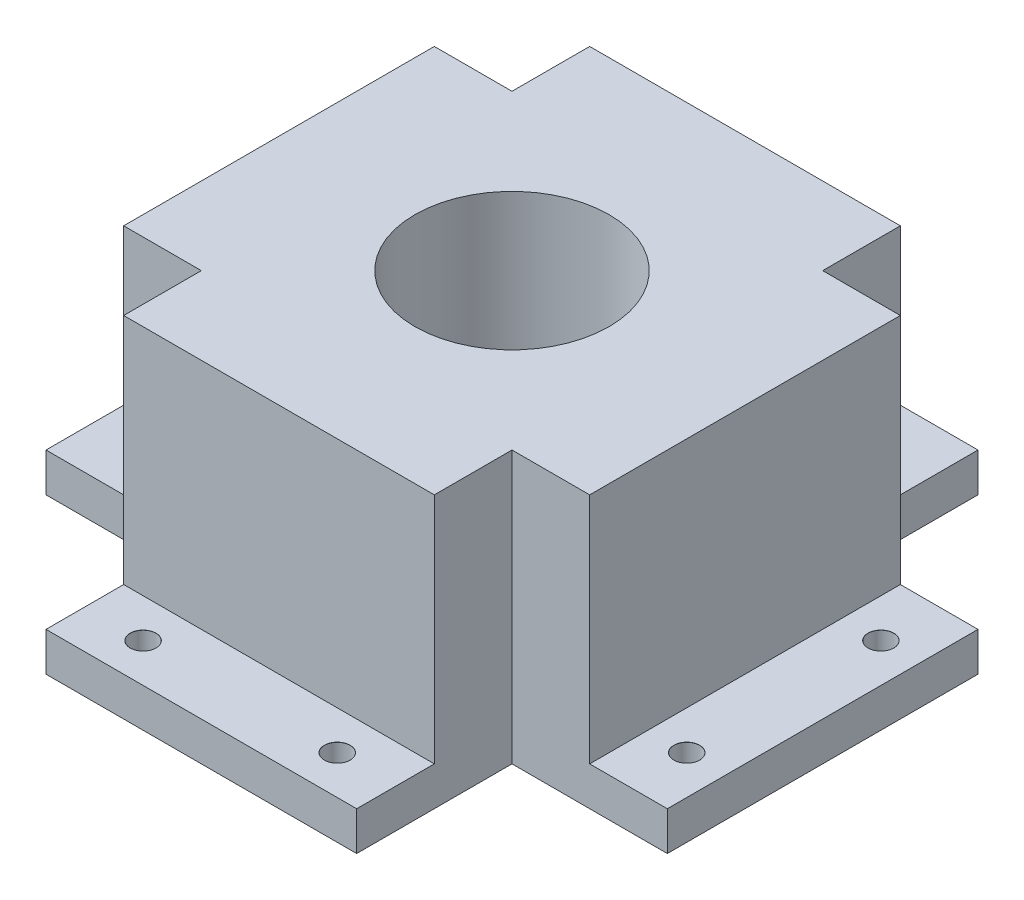
ISO-10303-21;
HEADER;
FILE_DESCRIPTION(('STEP AP214'),'2;1');
FILE_NAME('part.step','',(''),(''),'','','');
FILE_SCHEMA(('AUTOMOTIVE_DESIGN { 1 0 10303 214 1 1 1 1 }'));
ENDSEC;
DATA;
#1=APPLICATION_CONTEXT('core data for automotive mechanical design processes');
#2=APPLICATION_PROTOCOL_DEFINITION('international standard','automotive_design',2000,#1);
#3=PRODUCT_CONTEXT('',#1,'mechanical');
#4=PRODUCT('Part','Part','',(#3));
#5=PRODUCT_RELATED_PRODUCT_CATEGORY('part','',(#4));
#6=PRODUCT_DEFINITION_FORMATION('','',#4);
#7=PRODUCT_DEFINITION_CONTEXT('part definition',#1,'design');
#8=PRODUCT_DEFINITION('design','',#6,#7);
#9=PRODUCT_DEFINITION_SHAPE('','',#8);
#10=(LENGTH_UNIT() NAMED_UNIT(*) SI_UNIT(.MILLI.,.METRE.));
#11=(NAMED_UNIT(*) PLANE_ANGLE_UNIT() SI_UNIT($,.RADIAN.));
#12=(NAMED_UNIT(*) SI_UNIT($,.STERADIAN.) SOLID_ANGLE_UNIT());
#13=UNCERTAINTY_MEASURE_WITH_UNIT(LENGTH_MEASURE(1.E-05),#10,'distance_accuracy_value','');
#14=(GEOMETRIC_REPRESENTATION_CONTEXT(3) GLOBAL_UNCERTAINTY_ASSIGNED_CONTEXT((#13)) GLOBAL_UNIT_ASSIGNED_CONTEXT((#10,
#11,#12)) REPRESENTATION_CONTEXT('',''));
#15=CARTESIAN_POINT('',(0.,0.,0.));
#16=DIRECTION('',(0.,0.,1.));
#17=DIRECTION('',(1.,0.,0.));
#18=AXIS2_PLACEMENT_3D('',#15,#16,#17);
#19=CARTESIAN_POINT('',(80.,70.,-80.));
#20=DIRECTION('',(-1.,0.,0.));
#21=DIRECTION('',(0.,0.,1.));
#22=AXIS2_PLACEMENT_3D('',#19,#20,#21);
#23=PLANE('',#22);
#24=DIRECTION('',(0.,0.,1.));
#25=VECTOR('',#24,1.);
#26=CARTESIAN_POINT('',(80.,9.99999999999999,0.));
#27=LINE('',#26,#25);
#28=CARTESIAN_POINT('',(80.,10.,-40.));
#29=VERTEX_POINT('',#28);
#30=CARTESIAN_POINT('',(80.,9.99999999999999,40.));
#31=VERTEX_POINT('',#30);
#32=EDGE_CURVE('E321',#29,#31,#27,.T.);
#33=ORIENTED_EDGE('',*,*,#32,.T.);
#34=DIRECTION('',(0.,1.,0.));
#35=VECTOR('',#34,1.);
#36=CARTESIAN_POINT('',(80.,0.,40.));
#37=LINE('',#36,#35);
#38=CARTESIAN_POINT('',(80.,0.,40.));
#39=VERTEX_POINT('',#38);
#40=EDGE_CURVE('E349',#39,#31,#37,.T.);
#41=ORIENTED_EDGE('',*,*,#40,.F.);
#42=DIRECTION('',(0.,0.,-1.));
#43=VECTOR('',#42,1.);
#44=CARTESIAN_POINT('',(80.,0.,-80.));
#45=LINE('',#44,#43);
#46=CARTESIAN_POINT('',(80.,0.,-40.));
#47=VERTEX_POINT('',#46);
#48=EDGE_CURVE('E220',#39,#47,#45,.T.);
#49=ORIENTED_EDGE('',*,*,#48,.T.);
#50=DIRECTION('',(0.,1.,0.));
#51=VECTOR('',#50,1.);
#52=CARTESIAN_POINT('',(80.,0.,-40.));
#53=LINE('',#52,#51);
#54=EDGE_CURVE('E275',#47,#29,#53,.T.);
#55=ORIENTED_EDGE('',*,*,#54,.T.);
#56=EDGE_LOOP('',(#33,#41,#49,#55));
#57=FACE_BOUND('',#56,.T.);
#58=ADVANCED_FACE('F45',(#57),#23,.F.);
#59=CARTESIAN_POINT('',(-80.,70.,-80.));
#60=DIRECTION('',(0.,0.,1.));
#61=DIRECTION('',(1.,0.,0.));
#62=AXIS2_PLACEMENT_3D('',#59,#60,#61);
#63=PLANE('',#62);
#64=DIRECTION('',(1.,0.,0.));
#65=VECTOR('',#64,1.);
#66=CARTESIAN_POINT('',(0.,9.99999999999999,-80.));
#67=LINE('',#66,#65);
#68=CARTESIAN_POINT('',(-40.,9.99999999999999,-80.));
#69=VERTEX_POINT('',#68);
#70=CARTESIAN_POINT('',(40.,9.99999999999999,-80.));
#71=VERTEX_POINT('',#70);
#72=EDGE_CURVE('E265',#69,#71,#67,.T.);
#73=ORIENTED_EDGE('',*,*,#72,.T.);
#74=DIRECTION('',(0.,1.,0.));
#75=VECTOR('',#74,1.);
#76=CARTESIAN_POINT('',(40.,0.,-80.));
#77=LINE('',#76,#75);
#78=CARTESIAN_POINT('',(40.,0.,-80.));
#79=VERTEX_POINT('',#78);
#80=EDGE_CURVE('E264',#79,#71,#77,.T.);
#81=ORIENTED_EDGE('',*,*,#80,.F.);
#82=DIRECTION('',(-1.,0.,0.));
#83=VECTOR('',#82,1.);
#84=CARTESIAN_POINT('',(-80.,0.,-80.));
#85=LINE('',#84,#83);
#86=CARTESIAN_POINT('',(-40.,0.,-80.));
#87=VERTEX_POINT('',#86);
#88=EDGE_CURVE('E227',#79,#87,#85,.T.);
#89=ORIENTED_EDGE('',*,*,#88,.T.);
#90=DIRECTION('',(0.,1.,0.));
#91=VECTOR('',#90,1.);
#92=CARTESIAN_POINT('',(-40.,0.,-80.));
#93=LINE('',#92,#91);
#94=EDGE_CURVE('E217',#87,#69,#93,.T.);
#95=ORIENTED_EDGE('',*,*,#94,.T.);
#96=EDGE_LOOP('',(#73,#81,#89,#95));
#97=FACE_BOUND('',#96,.T.);
#98=ADVANCED_FACE('F262',(#97),#63,.F.);
#99=CARTESIAN_POINT('',(-80.,70.,-80.));
#100=DIRECTION('',(1.,0.,0.));
#101=DIRECTION('',(0.,0.,-1.));
#102=AXIS2_PLACEMENT_3D('',#99,#100,#101);
#103=PLANE('',#102);
#104=DIRECTION('',(0.,0.,-1.));
#105=VECTOR('',#104,1.);
#106=CARTESIAN_POINT('',(-80.,9.99999999999999,0.));
#107=LINE('',#106,#105);
#108=CARTESIAN_POINT('',(-80.,10.,40.));
#109=VERTEX_POINT('',#108);
#110=CARTESIAN_POINT('',(-80.,9.99999999999999,-40.));
#111=VERTEX_POINT('',#110);
#112=EDGE_CURVE('E59',#109,#111,#107,.T.);
#113=ORIENTED_EDGE('',*,*,#112,.T.);
#114=DIRECTION('',(0.,1.,0.));
#115=VECTOR('',#114,1.);
#116=CARTESIAN_POINT('',(-80.,0.,-40.));
#117=LINE('',#116,#115);
#118=CARTESIAN_POINT('',(-80.,0.,-40.));
#119=VERTEX_POINT('',#118);
#120=EDGE_CURVE('E222',#119,#111,#117,.T.);
#121=ORIENTED_EDGE('',*,*,#120,.F.);
#122=DIRECTION('',(0.,0.,1.));
#123=VECTOR('',#122,1.);
#124=CARTESIAN_POINT('',(-80.,0.,-80.));
#125=LINE('',#124,#123);
#126=CARTESIAN_POINT('',(-80.,0.,40.));
#127=VERTEX_POINT('',#126);
#128=EDGE_CURVE('E52',#119,#127,#125,.T.);
#129=ORIENTED_EDGE('',*,*,#128,.T.);
#130=DIRECTION('',(0.,1.,0.));
#131=VECTOR('',#130,1.);
#132=CARTESIAN_POINT('',(-80.,0.,40.));
#133=LINE('',#132,#131);
#134=EDGE_CURVE('E235',#127,#109,#133,.T.);
#135=ORIENTED_EDGE('',*,*,#134,.T.);
#136=EDGE_LOOP('',(#113,#121,#129,#135));
#137=FACE_BOUND('',#136,.T.);
#138=ADVANCED_FACE('F234',(#137),#103,.F.);
#139=CARTESIAN_POINT('',(-80.,70.,80.));
#140=DIRECTION('',(0.,0.,-1.));
#141=DIRECTION('',(-1.,0.,0.));
#142=AXIS2_PLACEMENT_3D('',#139,#140,#141);
#143=PLANE('',#142);
#144=DIRECTION('',(-1.,0.,0.));
#145=VECTOR('',#144,1.);
#146=CARTESIAN_POINT('',(0.,9.99999999999999,80.));
#147=LINE('',#146,#145);
#148=CARTESIAN_POINT('',(40.,9.99999999999999,80.));
#149=VERTEX_POINT('',#148);
#150=CARTESIAN_POINT('',(-40.,9.99999999999999,80.));
#151=VERTEX_POINT('',#150);
#152=EDGE_CURVE('E334',#149,#151,#147,.T.);
#153=ORIENTED_EDGE('',*,*,#152,.T.);
#154=DIRECTION('',(0.,1.,0.));
#155=VECTOR('',#154,1.);
#156=CARTESIAN_POINT('',(-40.,0.,80.));
#157=LINE('',#156,#155);
#158=CARTESIAN_POINT('',(-40.,0.,80.));
#159=VERTEX_POINT('',#158);
#160=EDGE_CURVE('E248',#159,#151,#157,.T.);
#161=ORIENTED_EDGE('',*,*,#160,.F.);
#162=DIRECTION('',(1.,0.,0.));
#163=VECTOR('',#162,1.);
#164=CARTESIAN_POINT('',(-80.,0.,80.));
#165=LINE('',#164,#163);
#166=CARTESIAN_POINT('',(40.,0.,80.));
#167=VERTEX_POINT('',#166);
#168=EDGE_CURVE('E12',#159,#167,#165,.T.);
#169=ORIENTED_EDGE('',*,*,#168,.T.);
#170=DIRECTION('',(0.,1.,0.));
#171=VECTOR('',#170,1.);
#172=CARTESIAN_POINT('',(40.,0.,80.));
#173=LINE('',#172,#171);
#174=EDGE_CURVE('E356',#167,#149,#173,.T.);
#175=ORIENTED_EDGE('',*,*,#174,.T.);
#176=EDGE_LOOP('',(#153,#161,#169,#175));
#177=FACE_BOUND('',#176,.T.);
#178=ADVANCED_FACE('F387',(#177),#143,.F.);
#179=CARTESIAN_POINT('',(0.,70.,0.));
#180=DIRECTION('',(0.,1.,0.));
#181=DIRECTION('',(0.,0.,1.));
#182=AXIS2_PLACEMENT_3D('',#179,#180,#181);
#183=PLANE('',#182);
#184=CARTESIAN_POINT('',(0.,70.,0.));
#185=DIRECTION('',(0.,1.,0.));
#186=DIRECTION('',(0.,0.,1.));
#187=AXIS2_PLACEMENT_3D('',#184,#185,#186);
#188=CIRCLE('',#187,25.);
#189=CARTESIAN_POINT('',(0.,70.,25.));
#190=VERTEX_POINT('',#189);
#191=EDGE_CURVE('E838',#190,#190,#188,.T.);
#192=ORIENTED_EDGE('',*,*,#191,.F.);
#193=EDGE_LOOP('',(#192));
#194=FACE_BOUND('',#193,.T.);
#195=DIRECTION('',(1.,0.,0.));
#196=VECTOR('',#195,1.);
#197=CARTESIAN_POINT('',(0.,70.,-60.));
#198=LINE('',#197,#196);
#199=CARTESIAN_POINT('',(-40.,70.,-60.));
#200=VERTEX_POINT('',#199);
#201=CARTESIAN_POINT('',(40.,70.,-60.));
#202=VERTEX_POINT('',#201);
#203=EDGE_CURVE('E185',#200,#202,#198,.T.);
#204=ORIENTED_EDGE('',*,*,#203,.F.);
#205=DIRECTION('',(0.,0.,-1.));
#206=VECTOR('',#205,1.);
#207=CARTESIAN_POINT('',(-40.,70.,-80.));
#208=LINE('',#207,#206);
#209=CARTESIAN_POINT('',(-40.,70.,-40.));
#210=VERTEX_POINT('',#209);
#211=EDGE_CURVE('E199',#210,#200,#208,.T.);
#212=ORIENTED_EDGE('',*,*,#211,.F.);
#213=DIRECTION('',(1.,0.,0.));
#214=VECTOR('',#213,1.);
#215=CARTESIAN_POINT('',(-80.,70.,-40.));
#216=LINE('',#215,#214);
#217=CARTESIAN_POINT('',(-60.,70.,-40.));
#218=VERTEX_POINT('',#217);
#219=EDGE_CURVE('E209',#218,#210,#216,.T.);
#220=ORIENTED_EDGE('',*,*,#219,.F.);
#221=DIRECTION('',(0.,0.,1.));
#222=VECTOR('',#221,1.);
#223=CARTESIAN_POINT('',(-60.,70.,0.));
#224=LINE('',#223,#222);
#225=CARTESIAN_POINT('',(-60.,70.,40.));
#226=VERTEX_POINT('',#225);
#227=EDGE_CURVE('E300',#218,#226,#224,.T.);
#228=ORIENTED_EDGE('',*,*,#227,.T.);
#229=DIRECTION('',(-1.,0.,0.));
#230=VECTOR('',#229,1.);
#231=CARTESIAN_POINT('',(-80.,70.,40.));
#232=LINE('',#231,#230);
#233=CARTESIAN_POINT('',(-40.,70.,40.));
#234=VERTEX_POINT('',#233);
#235=EDGE_CURVE('E250',#234,#226,#232,.T.);
#236=ORIENTED_EDGE('',*,*,#235,.F.);
#237=DIRECTION('',(0.,0.,-1.));
#238=VECTOR('',#237,1.);
#239=CARTESIAN_POINT('',(-40.,70.,80.));
#240=LINE('',#239,#238);
#241=CARTESIAN_POINT('',(-40.,70.,60.));
#242=VERTEX_POINT('',#241);
#243=EDGE_CURVE('E256',#242,#234,#240,.T.);
#244=ORIENTED_EDGE('',*,*,#243,.F.);
#245=DIRECTION('',(1.,0.,0.));
#246=VECTOR('',#245,1.);
#247=CARTESIAN_POINT('',(0.,70.,60.));
#248=LINE('',#247,#246);
#249=CARTESIAN_POINT('',(40.,70.,60.));
#250=VERTEX_POINT('',#249);
#251=EDGE_CURVE('E343',#242,#250,#248,.T.);
#252=ORIENTED_EDGE('',*,*,#251,.T.);
#253=DIRECTION('',(0.,0.,1.));
#254=VECTOR('',#253,1.);
#255=CARTESIAN_POINT('',(40.,70.,80.));
#256=LINE('',#255,#254);
#257=CARTESIAN_POINT('',(40.,70.,40.));
#258=VERTEX_POINT('',#257);
#259=EDGE_CURVE('E359',#258,#250,#256,.T.);
#260=ORIENTED_EDGE('',*,*,#259,.F.);
#261=DIRECTION('',(-1.,0.,0.));
#262=VECTOR('',#261,1.);
#263=CARTESIAN_POINT('',(80.,70.,40.));
#264=LINE('',#263,#262);
#265=CARTESIAN_POINT('',(60.,70.,40.));
#266=VERTEX_POINT('',#265);
#267=EDGE_CURVE('E289',#266,#258,#264,.T.);
#268=ORIENTED_EDGE('',*,*,#267,.F.);
#269=DIRECTION('',(0.,0.,1.));
#270=VECTOR('',#269,1.);
#271=CARTESIAN_POINT('',(60.,70.,0.));
#272=LINE('',#271,#270);
#273=CARTESIAN_POINT('',(60.,70.,-40.));
#274=VERTEX_POINT('',#273);
#275=EDGE_CURVE('E327',#274,#266,#272,.T.);
#276=ORIENTED_EDGE('',*,*,#275,.F.);
#277=DIRECTION('',(1.,0.,0.));
#278=VECTOR('',#277,1.);
#279=CARTESIAN_POINT('',(80.,70.,-40.));
#280=LINE('',#279,#278);
#281=CARTESIAN_POINT('',(40.,70.,-40.));
#282=VERTEX_POINT('',#281);
#283=EDGE_CURVE('E283',#282,#274,#280,.T.);
#284=ORIENTED_EDGE('',*,*,#283,.F.);
#285=DIRECTION('',(0.,0.,1.));
#286=VECTOR('',#285,1.);
#287=CARTESIAN_POINT('',(40.,70.,-80.));
#288=LINE('',#287,#286);
#289=EDGE_CURVE('E201',#202,#282,#288,.T.);
#290=ORIENTED_EDGE('',*,*,#289,.F.);
#291=EDGE_LOOP('',(#204,#212,#220,#228,#236,#244,#252,#260,#268,#276,#284,#290));
#292=FACE_BOUND('',#291,.T.);
#293=ADVANCED_FACE('F197',(#194,#292),#183,.T.);
#294=CARTESIAN_POINT('',(-80.,0.,-40.));
#295=DIRECTION('',(0.,0.,1.));
#296=DIRECTION('',(1.,0.,0.));
#297=AXIS2_PLACEMENT_3D('',#294,#295,#296);
#298=PLANE('',#297);
#299=DIRECTION('',(0.,1.,0.));
#300=VECTOR('',#299,1.);
#301=CARTESIAN_POINT('',(-60.,-82.4621125123532,-40.));
#302=LINE('',#301,#300);
#303=CARTESIAN_POINT('',(-60.,9.99999999999999,-40.));
#304=VERTEX_POINT('',#303);
#305=EDGE_CURVE('E304',#304,#218,#302,.T.);
#306=ORIENTED_EDGE('',*,*,#305,.T.);
#307=ORIENTED_EDGE('',*,*,#219,.T.);
#308=DIRECTION('',(0.,1.,0.));
#309=VECTOR('',#308,1.);
#310=CARTESIAN_POINT('',(-40.,0.,-40.));
#311=LINE('',#310,#309);
#312=CARTESIAN_POINT('',(-40.,0.,-40.));
#313=VERTEX_POINT('',#312);
#314=EDGE_CURVE('E207',#313,#210,#311,.T.);
#315=ORIENTED_EDGE('',*,*,#314,.F.);
#316=DIRECTION('',(1.,0.,0.));
#317=VECTOR('',#316,1.);
#318=CARTESIAN_POINT('',(-80.,0.,-40.));
#319=LINE('',#318,#317);
#320=EDGE_CURVE('E208',#119,#313,#319,.T.);
#321=ORIENTED_EDGE('',*,*,#320,.F.);
#322=ORIENTED_EDGE('',*,*,#120,.T.);
#323=DIRECTION('',(1.,0.,0.));
#324=VECTOR('',#323,1.);
#325=CARTESIAN_POINT('',(0.,9.99999999999999,-40.));
#326=LINE('',#325,#324);
#327=EDGE_CURVE('E202',#111,#304,#326,.T.);
#328=ORIENTED_EDGE('',*,*,#327,.T.);
#329=EDGE_LOOP('',(#306,#307,#315,#321,#322,#328));
#330=FACE_BOUND('',#329,.T.);
#331=ADVANCED_FACE('F420',(#330),#298,.F.);
#332=CARTESIAN_POINT('',(40.,0.,80.));
#333=DIRECTION('',(-1.,0.,0.));
#334=DIRECTION('',(0.,0.,1.));
#335=AXIS2_PLACEMENT_3D('',#332,#333,#334);
#336=PLANE('',#335);
#337=DIRECTION('',(0.,1.,0.));
#338=VECTOR('',#337,1.);
#339=CARTESIAN_POINT('',(40.,-82.4621125123532,60.));
#340=LINE('',#339,#338);
#341=CARTESIAN_POINT('',(40.,9.99999999999999,60.));
#342=VERTEX_POINT('',#341);
#343=EDGE_CURVE('E338',#342,#250,#340,.T.);
#344=ORIENTED_EDGE('',*,*,#343,.F.);
#345=DIRECTION('',(0.,0.,1.));
#346=VECTOR('',#345,1.);
#347=CARTESIAN_POINT('',(40.,9.99999999999999,0.));
#348=LINE('',#347,#346);
#349=EDGE_CURVE('E337',#342,#149,#348,.T.);
#350=ORIENTED_EDGE('',*,*,#349,.T.);
#351=ORIENTED_EDGE('',*,*,#174,.F.);
#352=DIRECTION('',(0.,0.,1.));
#353=VECTOR('',#352,1.);
#354=CARTESIAN_POINT('',(40.,0.,80.));
#355=LINE('',#354,#353);
#356=CARTESIAN_POINT('',(40.,0.,40.));
#357=VERTEX_POINT('',#356);
#358=EDGE_CURVE('E352',#357,#167,#355,.T.);
#359=ORIENTED_EDGE('',*,*,#358,.F.);
#360=DIRECTION('',(0.,1.,0.));
#361=VECTOR('',#360,1.);
#362=CARTESIAN_POINT('',(40.,0.,40.));
#363=LINE('',#362,#361);
#364=EDGE_CURVE('E353',#357,#258,#363,.T.);
#365=ORIENTED_EDGE('',*,*,#364,.T.);
#366=ORIENTED_EDGE('',*,*,#259,.T.);
#367=EDGE_LOOP('',(#344,#350,#351,#359,#365,#366));
#368=FACE_BOUND('',#367,.T.);
#369=ADVANCED_FACE('F384',(#368),#336,.F.);
#370=CARTESIAN_POINT('',(-80.,0.,40.));
#371=DIRECTION('',(0.,0.,-1.));
#372=DIRECTION('',(-1.,0.,0.));
#373=AXIS2_PLACEMENT_3D('',#370,#371,#372);
#374=PLANE('',#373);
#375=DIRECTION('',(0.,1.,0.));
#376=VECTOR('',#375,1.);
#377=CARTESIAN_POINT('',(-60.,-82.4621125123532,40.));
#378=LINE('',#377,#376);
#379=CARTESIAN_POINT('',(-60.,9.99999999999999,40.));
#380=VERTEX_POINT('',#379);
#381=EDGE_CURVE('E307',#380,#226,#378,.T.);
#382=ORIENTED_EDGE('',*,*,#381,.F.);
#383=DIRECTION('',(-1.,0.,0.));
#384=VECTOR('',#383,1.);
#385=CARTESIAN_POINT('',(0.,9.99999999999999,40.));
#386=LINE('',#385,#384);
#387=EDGE_CURVE('E826',#380,#109,#386,.T.);
#388=ORIENTED_EDGE('',*,*,#387,.T.);
#389=ORIENTED_EDGE('',*,*,#134,.F.);
#390=DIRECTION('',(-1.,0.,0.));
#391=VECTOR('',#390,1.);
#392=CARTESIAN_POINT('',(-80.,0.,40.));
#393=LINE('',#392,#391);
#394=CARTESIAN_POINT('',(-40.,0.,40.));
#395=VERTEX_POINT('',#394);
#396=EDGE_CURVE('E242',#395,#127,#393,.T.);
#397=ORIENTED_EDGE('',*,*,#396,.F.);
#398=DIRECTION('',(0.,1.,0.));
#399=VECTOR('',#398,1.);
#400=CARTESIAN_POINT('',(-40.,0.,40.));
#401=LINE('',#400,#399);
#402=EDGE_CURVE('E253',#395,#234,#401,.T.);
#403=ORIENTED_EDGE('',*,*,#402,.T.);
#404=ORIENTED_EDGE('',*,*,#235,.T.);
#405=EDGE_LOOP('',(#382,#388,#389,#397,#403,#404));
#406=FACE_BOUND('',#405,.T.);
#407=ADVANCED_FACE('F298',(#406),#374,.F.);
#408=CARTESIAN_POINT('',(-40.,0.,80.));
#409=DIRECTION('',(1.,0.,0.));
#410=DIRECTION('',(0.,0.,-1.));
#411=AXIS2_PLACEMENT_3D('',#408,#409,#410);
#412=PLANE('',#411);
#413=DIRECTION('',(0.,1.,0.));
#414=VECTOR('',#413,1.);
#415=CARTESIAN_POINT('',(-40.,-82.4621125123532,60.));
#416=LINE('',#415,#414);
#417=CARTESIAN_POINT('',(-40.,10.,60.));
#418=VERTEX_POINT('',#417);
#419=EDGE_CURVE('E67',#418,#242,#416,.T.);
#420=ORIENTED_EDGE('',*,*,#419,.T.);
#421=ORIENTED_EDGE('',*,*,#243,.T.);
#422=ORIENTED_EDGE('',*,*,#402,.F.);
#423=DIRECTION('',(0.,0.,-1.));
#424=VECTOR('',#423,1.);
#425=CARTESIAN_POINT('',(-40.,0.,80.));
#426=LINE('',#425,#424);
#427=EDGE_CURVE('E244',#159,#395,#426,.T.);
#428=ORIENTED_EDGE('',*,*,#427,.F.);
#429=ORIENTED_EDGE('',*,*,#160,.T.);
#430=DIRECTION('',(0.,0.,-1.));
#431=VECTOR('',#430,1.);
#432=CARTESIAN_POINT('',(-40.,9.99999999999999,0.));
#433=LINE('',#432,#431);
#434=EDGE_CURVE('E330',#151,#418,#433,.T.);
#435=ORIENTED_EDGE('',*,*,#434,.T.);
#436=EDGE_LOOP('',(#420,#421,#422,#428,#429,#435));
#437=FACE_BOUND('',#436,.T.);
#438=ADVANCED_FACE('F295',(#437),#412,.F.);
#439=CARTESIAN_POINT('',(0.,0.,0.));
#440=DIRECTION('',(0.,1.,0.));
#441=DIRECTION('',(0.,0.,1.));
#442=AXIS2_PLACEMENT_3D('',#439,#440,#441);
#443=PLANE('',#442);
#444=CARTESIAN_POINT('',(-70.,0.,-25.));
#445=DIRECTION('',(0.,1.,0.));
#446=DIRECTION('',(0.,0.,1.));
#447=AXIS2_PLACEMENT_3D('',#444,#445,#446);
#448=CIRCLE('',#447,3.3);
#449=CARTESIAN_POINT('',(-70.,0.,-21.7));
#450=VERTEX_POINT('',#449);
#451=EDGE_CURVE('E904',#450,#450,#448,.T.);
#452=ORIENTED_EDGE('',*,*,#451,.T.);
#453=EDGE_LOOP('',(#452));
#454=FACE_BOUND('',#453,.T.);
#455=CARTESIAN_POINT('',(-70.,0.,25.));
#456=DIRECTION('',(0.,1.,0.));
#457=DIRECTION('',(0.,0.,1.));
#458=AXIS2_PLACEMENT_3D('',#455,#456,#457);
#459=CIRCLE('',#458,3.3);
#460=CARTESIAN_POINT('',(-70.,0.,28.3));
#461=VERTEX_POINT('',#460);
#462=EDGE_CURVE('E895',#461,#461,#459,.T.);
#463=ORIENTED_EDGE('',*,*,#462,.T.);
#464=EDGE_LOOP('',(#463));
#465=FACE_BOUND('',#464,.T.);
#466=CARTESIAN_POINT('',(-25.,0.,-70.));
#467=DIRECTION('',(0.,1.,0.));
#468=DIRECTION('',(0.,0.,1.));
#469=AXIS2_PLACEMENT_3D('',#466,#467,#468);
#470=CIRCLE('',#469,3.29999999999999);
#471=CARTESIAN_POINT('',(-25.,0.,-66.7));
#472=VERTEX_POINT('',#471);
#473=EDGE_CURVE('E886',#472,#472,#470,.T.);
#474=ORIENTED_EDGE('',*,*,#473,.T.);
#475=EDGE_LOOP('',(#474));
#476=FACE_BOUND('',#475,.T.);
#477=CARTESIAN_POINT('',(25.,0.,-70.));
#478=DIRECTION('',(0.,1.,0.));
#479=DIRECTION('',(0.,0.,1.));
#480=AXIS2_PLACEMENT_3D('',#477,#478,#479);
#481=CIRCLE('',#480,3.29999999999999);
#482=CARTESIAN_POINT('',(25.,0.,-66.7));
#483=VERTEX_POINT('',#482);
#484=EDGE_CURVE('E877',#483,#483,#481,.T.);
#485=ORIENTED_EDGE('',*,*,#484,.T.);
#486=EDGE_LOOP('',(#485));
#487=FACE_BOUND('',#486,.T.);
#488=CARTESIAN_POINT('',(70.,0.,-25.));
#489=DIRECTION('',(0.,1.,0.));
#490=DIRECTION('',(0.,0.,1.));
#491=AXIS2_PLACEMENT_3D('',#488,#489,#490);
#492=CIRCLE('',#491,3.3);
#493=CARTESIAN_POINT('',(70.,0.,-21.7));
#494=VERTEX_POINT('',#493);
#495=EDGE_CURVE('E868',#494,#494,#492,.T.);
#496=ORIENTED_EDGE('',*,*,#495,.T.);
#497=EDGE_LOOP('',(#496));
#498=FACE_BOUND('',#497,.T.);
#499=CARTESIAN_POINT('',(70.,0.,25.));
#500=DIRECTION('',(0.,1.,0.));
#501=DIRECTION('',(0.,0.,1.));
#502=AXIS2_PLACEMENT_3D('',#499,#500,#501);
#503=CIRCLE('',#502,3.3);
#504=CARTESIAN_POINT('',(70.,0.,28.3));
#505=VERTEX_POINT('',#504);
#506=EDGE_CURVE('E859',#505,#505,#503,.T.);
#507=ORIENTED_EDGE('',*,*,#506,.T.);
#508=EDGE_LOOP('',(#507));
#509=FACE_BOUND('',#508,.T.);
#510=CARTESIAN_POINT('',(25.,0.,70.));
#511=DIRECTION('',(0.,1.,0.));
#512=DIRECTION('',(0.,0.,1.));
#513=AXIS2_PLACEMENT_3D('',#510,#511,#512);
#514=CIRCLE('',#513,3.29999999999999);
#515=CARTESIAN_POINT('',(25.,0.,73.3));
#516=VERTEX_POINT('',#515);
#517=EDGE_CURVE('E850',#516,#516,#514,.T.);
#518=ORIENTED_EDGE('',*,*,#517,.T.);
#519=EDGE_LOOP('',(#518));
#520=FACE_BOUND('',#519,.T.);
#521=CARTESIAN_POINT('',(-25.,0.,70.));
#522=DIRECTION('',(0.,1.,0.));
#523=DIRECTION('',(0.,0.,1.));
#524=AXIS2_PLACEMENT_3D('',#521,#522,#523);
#525=CIRCLE('',#524,3.29999999999999);
#526=CARTESIAN_POINT('',(-25.,0.,73.3));
#527=VERTEX_POINT('',#526);
#528=EDGE_CURVE('E841',#527,#527,#525,.T.);
#529=ORIENTED_EDGE('',*,*,#528,.T.);
#530=EDGE_LOOP('',(#529));
#531=FACE_BOUND('',#530,.T.);
#532=CARTESIAN_POINT('',(0.,0.,0.));
#533=DIRECTION('',(0.,1.,0.));
#534=DIRECTION('',(0.,0.,1.));
#535=AXIS2_PLACEMENT_3D('',#532,#533,#534);
#536=CIRCLE('',#535,25.);
#537=CARTESIAN_POINT('',(0.,0.,25.));
#538=VERTEX_POINT('',#537);
#539=EDGE_CURVE('E345',#538,#538,#536,.F.);
#540=ORIENTED_EDGE('',*,*,#539,.F.);
#541=EDGE_LOOP('',(#540));
#542=FACE_BOUND('',#541,.T.);
#543=DIRECTION('',(0.,0.,1.));
#544=VECTOR('',#543,1.);
#545=CARTESIAN_POINT('',(40.,0.,-80.));
#546=LINE('',#545,#544);
#547=CARTESIAN_POINT('',(40.,0.,-40.));
#548=VERTEX_POINT('',#547);
#549=EDGE_CURVE('E272',#79,#548,#546,.T.);
#550=ORIENTED_EDGE('',*,*,#549,.T.);
#551=DIRECTION('',(1.,0.,0.));
#552=VECTOR('',#551,1.);
#553=CARTESIAN_POINT('',(80.,0.,-40.));
#554=LINE('',#553,#552);
#555=EDGE_CURVE('E268',#548,#47,#554,.T.);
#556=ORIENTED_EDGE('',*,*,#555,.T.);
#557=ORIENTED_EDGE('',*,*,#48,.F.);
#558=DIRECTION('',(-1.,0.,0.));
#559=VECTOR('',#558,1.);
#560=CARTESIAN_POINT('',(80.,0.,40.));
#561=LINE('',#560,#559);
#562=EDGE_CURVE('E278',#39,#357,#561,.T.);
#563=ORIENTED_EDGE('',*,*,#562,.T.);
#564=ORIENTED_EDGE('',*,*,#358,.T.);
#565=ORIENTED_EDGE('',*,*,#168,.F.);
#566=ORIENTED_EDGE('',*,*,#427,.T.);
#567=ORIENTED_EDGE('',*,*,#396,.T.);
#568=ORIENTED_EDGE('',*,*,#128,.F.);
#569=ORIENTED_EDGE('',*,*,#320,.T.);
#570=DIRECTION('',(0.,0.,-1.));
#571=VECTOR('',#570,1.);
#572=CARTESIAN_POINT('',(-40.,0.,-80.));
#573=LINE('',#572,#571);
#574=EDGE_CURVE('E212',#313,#87,#573,.T.);
#575=ORIENTED_EDGE('',*,*,#574,.T.);
#576=ORIENTED_EDGE('',*,*,#88,.F.);
#577=EDGE_LOOP('',(#550,#556,#557,#563,#564,#565,#566,#567,#568,#569,#575,#576));
#578=FACE_BOUND('',#577,.T.);
#579=ADVANCED_FACE('F239',(#454,#465,#476,#487,#498,#509,#520,#531,#542,#578),#443,.F.);
#580=CARTESIAN_POINT('',(-40.,0.,-80.));
#581=DIRECTION('',(1.,0.,0.));
#582=DIRECTION('',(0.,0.,-1.));
#583=AXIS2_PLACEMENT_3D('',#580,#581,#582);
#584=PLANE('',#583);
#585=ORIENTED_EDGE('',*,*,#211,.T.);
#586=DIRECTION('',(0.,1.,0.));
#587=VECTOR('',#586,1.);
#588=CARTESIAN_POINT('',(-40.,-82.4621125123532,-60.));
#589=LINE('',#588,#587);
#590=CARTESIAN_POINT('',(-40.,9.99999999999999,-60.));
#591=VERTEX_POINT('',#590);
#592=EDGE_CURVE('E181',#591,#200,#589,.T.);
#593=ORIENTED_EDGE('',*,*,#592,.F.);
#594=DIRECTION('',(0.,0.,-1.));
#595=VECTOR('',#594,1.);
#596=CARTESIAN_POINT('',(-40.,9.99999999999999,0.));
#597=LINE('',#596,#595);
#598=EDGE_CURVE('E829',#591,#69,#597,.T.);
#599=ORIENTED_EDGE('',*,*,#598,.T.);
#600=ORIENTED_EDGE('',*,*,#94,.F.);
#601=ORIENTED_EDGE('',*,*,#574,.F.);
#602=ORIENTED_EDGE('',*,*,#314,.T.);
#603=EDGE_LOOP('',(#585,#593,#599,#600,#601,#602));
#604=FACE_BOUND('',#603,.T.);
#605=ADVANCED_FACE('F205',(#604),#584,.F.);
#606=CARTESIAN_POINT('',(80.,0.,40.));
#607=DIRECTION('',(0.,0.,-1.));
#608=DIRECTION('',(-1.,0.,0.));
#609=AXIS2_PLACEMENT_3D('',#606,#607,#608);
#610=PLANE('',#609);
#611=DIRECTION('',(-1.,0.,0.));
#612=VECTOR('',#611,1.);
#613=CARTESIAN_POINT('',(0.,9.99999999999999,40.));
#614=LINE('',#613,#612);
#615=CARTESIAN_POINT('',(60.,9.99999999999999,40.));
#616=VERTEX_POINT('',#615);
#617=EDGE_CURVE('E318',#31,#616,#614,.T.);
#618=ORIENTED_EDGE('',*,*,#617,.T.);
#619=DIRECTION('',(0.,1.,0.));
#620=VECTOR('',#619,1.);
#621=CARTESIAN_POINT('',(60.,-82.4621125123532,40.));
#622=LINE('',#621,#620);
#623=EDGE_CURVE('E322',#616,#266,#622,.T.);
#624=ORIENTED_EDGE('',*,*,#623,.T.);
#625=ORIENTED_EDGE('',*,*,#267,.T.);
#626=ORIENTED_EDGE('',*,*,#364,.F.);
#627=ORIENTED_EDGE('',*,*,#562,.F.);
#628=ORIENTED_EDGE('',*,*,#40,.T.);
#629=EDGE_LOOP('',(#618,#624,#625,#626,#627,#628));
#630=FACE_BOUND('',#629,.T.);
#631=ADVANCED_FACE('F368',(#630),#610,.F.);
#632=CARTESIAN_POINT('',(80.,0.,-40.));
#633=DIRECTION('',(0.,0.,1.));
#634=DIRECTION('',(1.,0.,0.));
#635=AXIS2_PLACEMENT_3D('',#632,#633,#634);
#636=PLANE('',#635);
#637=ORIENTED_EDGE('',*,*,#283,.T.);
#638=DIRECTION('',(0.,1.,0.));
#639=VECTOR('',#638,1.);
#640=CARTESIAN_POINT('',(60.,-82.4621125123532,-40.));
#641=LINE('',#640,#639);
#642=CARTESIAN_POINT('',(60.,9.99999999999999,-40.));
#643=VERTEX_POINT('',#642);
#644=EDGE_CURVE('E329',#643,#274,#641,.T.);
#645=ORIENTED_EDGE('',*,*,#644,.F.);
#646=DIRECTION('',(1.,0.,0.));
#647=VECTOR('',#646,1.);
#648=CARTESIAN_POINT('',(0.,9.99999999999999,-40.));
#649=LINE('',#648,#647);
#650=EDGE_CURVE('E309',#643,#29,#649,.T.);
#651=ORIENTED_EDGE('',*,*,#650,.T.);
#652=ORIENTED_EDGE('',*,*,#54,.F.);
#653=ORIENTED_EDGE('',*,*,#555,.F.);
#654=DIRECTION('',(0.,1.,0.));
#655=VECTOR('',#654,1.);
#656=CARTESIAN_POINT('',(40.,0.,-40.));
#657=LINE('',#656,#655);
#658=EDGE_CURVE('E269',#548,#282,#657,.T.);
#659=ORIENTED_EDGE('',*,*,#658,.T.);
#660=EDGE_LOOP('',(#637,#645,#651,#652,#653,#659));
#661=FACE_BOUND('',#660,.T.);
#662=ADVANCED_FACE('F376',(#661),#636,.F.);
#663=CARTESIAN_POINT('',(40.,0.,-80.));
#664=DIRECTION('',(-1.,0.,0.));
#665=DIRECTION('',(0.,0.,1.));
#666=AXIS2_PLACEMENT_3D('',#663,#664,#665);
#667=PLANE('',#666);
#668=DIRECTION('',(0.,0.,1.));
#669=VECTOR('',#668,1.);
#670=CARTESIAN_POINT('',(40.,9.99999999999999,0.));
#671=LINE('',#670,#669);
#672=CARTESIAN_POINT('',(40.,10.,-60.));
#673=VERTEX_POINT('',#672);
#674=EDGE_CURVE('E831',#71,#673,#671,.T.);
#675=ORIENTED_EDGE('',*,*,#674,.T.);
#676=DIRECTION('',(0.,1.,0.));
#677=VECTOR('',#676,1.);
#678=CARTESIAN_POINT('',(40.,-82.4621125123532,-60.));
#679=LINE('',#678,#677);
#680=EDGE_CURVE('E192',#673,#202,#679,.T.);
#681=ORIENTED_EDGE('',*,*,#680,.T.);
#682=ORIENTED_EDGE('',*,*,#289,.T.);
#683=ORIENTED_EDGE('',*,*,#658,.F.);
#684=ORIENTED_EDGE('',*,*,#549,.F.);
#685=ORIENTED_EDGE('',*,*,#80,.T.);
#686=EDGE_LOOP('',(#675,#681,#682,#683,#684,#685));
#687=FACE_BOUND('',#686,.T.);
#688=ADVANCED_FACE('F433',(#687),#667,.F.);
#689=CARTESIAN_POINT('',(0.,-82.4621125123532,-60.));
#690=DIRECTION('',(0.,0.,1.));
#691=DIRECTION('',(1.,0.,0.));
#692=AXIS2_PLACEMENT_3D('',#689,#690,#691);
#693=PLANE('',#692);
#694=DIRECTION('',(-1.,0.,0.));
#695=VECTOR('',#694,1.);
#696=CARTESIAN_POINT('',(0.,9.99999999999999,-60.));
#697=LINE('',#696,#695);
#698=EDGE_CURVE('E187',#673,#591,#697,.T.);
#699=ORIENTED_EDGE('',*,*,#698,.T.);
#700=ORIENTED_EDGE('',*,*,#592,.T.);
#701=ORIENTED_EDGE('',*,*,#203,.T.);
#702=ORIENTED_EDGE('',*,*,#680,.F.);
#703=EDGE_LOOP('',(#699,#700,#701,#702));
#704=FACE_BOUND('',#703,.T.);
#705=ADVANCED_FACE('F183',(#704),#693,.F.);
#706=CARTESIAN_POINT('',(0.,10.,0.));
#707=DIRECTION('',(0.,1.,0.));
#708=DIRECTION('',(0.,0.,1.));
#709=AXIS2_PLACEMENT_3D('',#706,#707,#708);
#710=PLANE('',#709);
#711=CARTESIAN_POINT('',(-25.,10.,-70.));
#712=DIRECTION('',(0.,1.,0.));
#713=DIRECTION('',(0.,0.,1.));
#714=AXIS2_PLACEMENT_3D('',#711,#712,#713);
#715=CIRCLE('',#714,3.325);
#716=CARTESIAN_POINT('',(-25.,10.,-66.675));
#717=VERTEX_POINT('',#716);
#718=EDGE_CURVE('E892',#717,#717,#715,.T.);
#719=ORIENTED_EDGE('',*,*,#718,.F.);
#720=EDGE_LOOP('',(#719));
#721=FACE_BOUND('',#720,.T.);
#722=CARTESIAN_POINT('',(25.,10.,-70.));
#723=DIRECTION('',(0.,1.,0.));
#724=DIRECTION('',(0.,0.,1.));
#725=AXIS2_PLACEMENT_3D('',#722,#723,#724);
#726=CIRCLE('',#725,3.325);
#727=CARTESIAN_POINT('',(25.,10.,-66.675));
#728=VERTEX_POINT('',#727);
#729=EDGE_CURVE('E883',#728,#728,#726,.T.);
#730=ORIENTED_EDGE('',*,*,#729,.F.);
#731=EDGE_LOOP('',(#730));
#732=FACE_BOUND('',#731,.T.);
#733=ORIENTED_EDGE('',*,*,#598,.F.);
#734=ORIENTED_EDGE('',*,*,#698,.F.);
#735=ORIENTED_EDGE('',*,*,#674,.F.);
#736=ORIENTED_EDGE('',*,*,#72,.F.);
#737=EDGE_LOOP('',(#733,#734,#735,#736));
#738=FACE_BOUND('',#737,.T.);
#739=ADVANCED_FACE('F456',(#721,#732,#738),#710,.T.);
#740=CARTESIAN_POINT('',(60.,-82.4621125123532,0.));
#741=DIRECTION('',(-1.,0.,0.));
#742=DIRECTION('',(0.,0.,1.));
#743=AXIS2_PLACEMENT_3D('',#740,#741,#742);
#744=PLANE('',#743);
#745=DIRECTION('',(0.,0.,-1.));
#746=VECTOR('',#745,1.);
#747=CARTESIAN_POINT('',(60.,9.99999999999999,0.));
#748=LINE('',#747,#746);
#749=EDGE_CURVE('E305',#616,#643,#748,.T.);
#750=ORIENTED_EDGE('',*,*,#749,.T.);
#751=ORIENTED_EDGE('',*,*,#644,.T.);
#752=ORIENTED_EDGE('',*,*,#275,.T.);
#753=ORIENTED_EDGE('',*,*,#623,.F.);
#754=EDGE_LOOP('',(#750,#751,#752,#753));
#755=FACE_BOUND('',#754,.T.);
#756=ADVANCED_FACE('F379',(#755),#744,.F.);
#757=CARTESIAN_POINT('',(0.,10.,0.));
#758=DIRECTION('',(0.,1.,0.));
#759=DIRECTION('',(0.,0.,1.));
#760=AXIS2_PLACEMENT_3D('',#757,#758,#759);
#761=PLANE('',#760);
#762=CARTESIAN_POINT('',(70.,10.,-25.));
#763=DIRECTION('',(0.,1.,0.));
#764=DIRECTION('',(0.,0.,1.));
#765=AXIS2_PLACEMENT_3D('',#762,#763,#764);
#766=CIRCLE('',#765,3.32499999999999);
#767=CARTESIAN_POINT('',(70.,10.,-21.675));
#768=VERTEX_POINT('',#767);
#769=EDGE_CURVE('E874',#768,#768,#766,.T.);
#770=ORIENTED_EDGE('',*,*,#769,.F.);
#771=EDGE_LOOP('',(#770));
#772=FACE_BOUND('',#771,.T.);
#773=CARTESIAN_POINT('',(70.,10.,25.));
#774=DIRECTION('',(0.,1.,0.));
#775=DIRECTION('',(0.,0.,1.));
#776=AXIS2_PLACEMENT_3D('',#773,#774,#775);
#777=CIRCLE('',#776,3.32499999999999);
#778=CARTESIAN_POINT('',(70.,10.,28.325));
#779=VERTEX_POINT('',#778);
#780=EDGE_CURVE('E865',#779,#779,#777,.T.);
#781=ORIENTED_EDGE('',*,*,#780,.F.);
#782=EDGE_LOOP('',(#781));
#783=FACE_BOUND('',#782,.T.);
#784=ORIENTED_EDGE('',*,*,#650,.F.);
#785=ORIENTED_EDGE('',*,*,#749,.F.);
#786=ORIENTED_EDGE('',*,*,#617,.F.);
#787=ORIENTED_EDGE('',*,*,#32,.F.);
#788=EDGE_LOOP('',(#784,#785,#786,#787));
#789=FACE_BOUND('',#788,.T.);
#790=ADVANCED_FACE('F372',(#772,#783,#789),#761,.T.);
#791=CARTESIAN_POINT('',(0.,-82.4621125123532,60.));
#792=DIRECTION('',(0.,0.,1.));
#793=DIRECTION('',(1.,0.,0.));
#794=AXIS2_PLACEMENT_3D('',#791,#792,#793);
#795=PLANE('',#794);
#796=ORIENTED_EDGE('',*,*,#343,.T.);
#797=ORIENTED_EDGE('',*,*,#251,.F.);
#798=ORIENTED_EDGE('',*,*,#419,.F.);
#799=DIRECTION('',(-1.,0.,0.));
#800=VECTOR('',#799,1.);
#801=CARTESIAN_POINT('',(0.,9.99999999999999,60.));
#802=LINE('',#801,#800);
#803=EDGE_CURVE('E341',#342,#418,#802,.T.);
#804=ORIENTED_EDGE('',*,*,#803,.F.);
#805=EDGE_LOOP('',(#796,#797,#798,#804));
#806=FACE_BOUND('',#805,.T.);
#807=ADVANCED_FACE('F391',(#806),#795,.T.);
#808=CARTESIAN_POINT('',(0.,10.,0.));
#809=DIRECTION('',(0.,1.,0.));
#810=DIRECTION('',(0.,0.,1.));
#811=AXIS2_PLACEMENT_3D('',#808,#809,#810);
#812=PLANE('',#811);
#813=CARTESIAN_POINT('',(25.,10.,70.));
#814=DIRECTION('',(0.,1.,0.));
#815=DIRECTION('',(0.,0.,1.));
#816=AXIS2_PLACEMENT_3D('',#813,#814,#815);
#817=CIRCLE('',#816,3.325);
#818=CARTESIAN_POINT('',(25.,10.,73.325));
#819=VERTEX_POINT('',#818);
#820=EDGE_CURVE('E856',#819,#819,#817,.T.);
#821=ORIENTED_EDGE('',*,*,#820,.F.);
#822=EDGE_LOOP('',(#821));
#823=FACE_BOUND('',#822,.T.);
#824=CARTESIAN_POINT('',(-25.,10.,70.));
#825=DIRECTION('',(0.,1.,0.));
#826=DIRECTION('',(0.,0.,1.));
#827=AXIS2_PLACEMENT_3D('',#824,#825,#826);
#828=CIRCLE('',#827,3.325);
#829=CARTESIAN_POINT('',(-25.,10.,73.325));
#830=VERTEX_POINT('',#829);
#831=EDGE_CURVE('E847',#830,#830,#828,.T.);
#832=ORIENTED_EDGE('',*,*,#831,.F.);
#833=EDGE_LOOP('',(#832));
#834=FACE_BOUND('',#833,.T.);
#835=ORIENTED_EDGE('',*,*,#349,.F.);
#836=ORIENTED_EDGE('',*,*,#803,.T.);
#837=ORIENTED_EDGE('',*,*,#434,.F.);
#838=ORIENTED_EDGE('',*,*,#152,.F.);
#839=EDGE_LOOP('',(#835,#836,#837,#838));
#840=FACE_BOUND('',#839,.T.);
#841=ADVANCED_FACE('F390',(#823,#834,#840),#812,.T.);
#842=CARTESIAN_POINT('',(-60.,-82.4621125123532,0.));
#843=DIRECTION('',(-1.,0.,0.));
#844=DIRECTION('',(0.,0.,1.));
#845=AXIS2_PLACEMENT_3D('',#842,#843,#844);
#846=PLANE('',#845);
#847=ORIENTED_EDGE('',*,*,#381,.T.);
#848=ORIENTED_EDGE('',*,*,#227,.F.);
#849=ORIENTED_EDGE('',*,*,#305,.F.);
#850=DIRECTION('',(0.,0.,-1.));
#851=VECTOR('',#850,1.);
#852=CARTESIAN_POINT('',(-60.,9.99999999999999,0.));
#853=LINE('',#852,#851);
#854=EDGE_CURVE('E313',#380,#304,#853,.T.);
#855=ORIENTED_EDGE('',*,*,#854,.F.);
#856=EDGE_LOOP('',(#847,#848,#849,#855));
#857=FACE_BOUND('',#856,.T.);
#858=ADVANCED_FACE('F398',(#857),#846,.T.);
#859=CARTESIAN_POINT('',(0.,10.,0.));
#860=DIRECTION('',(0.,1.,0.));
#861=DIRECTION('',(0.,0.,1.));
#862=AXIS2_PLACEMENT_3D('',#859,#860,#861);
#863=PLANE('',#862);
#864=CARTESIAN_POINT('',(-70.,10.,-25.));
#865=DIRECTION('',(0.,1.,0.));
#866=DIRECTION('',(0.,0.,1.));
#867=AXIS2_PLACEMENT_3D('',#864,#865,#866);
#868=CIRCLE('',#867,3.32499999999999);
#869=CARTESIAN_POINT('',(-70.,10.,-21.675));
#870=VERTEX_POINT('',#869);
#871=EDGE_CURVE('E910',#870,#870,#868,.T.);
#872=ORIENTED_EDGE('',*,*,#871,.F.);
#873=EDGE_LOOP('',(#872));
#874=FACE_BOUND('',#873,.T.);
#875=CARTESIAN_POINT('',(-70.,10.,25.));
#876=DIRECTION('',(0.,1.,0.));
#877=DIRECTION('',(0.,0.,1.));
#878=AXIS2_PLACEMENT_3D('',#875,#876,#877);
#879=CIRCLE('',#878,3.32499999999999);
#880=CARTESIAN_POINT('',(-70.,10.,28.325));
#881=VERTEX_POINT('',#880);
#882=EDGE_CURVE('E901',#881,#881,#879,.T.);
#883=ORIENTED_EDGE('',*,*,#882,.F.);
#884=EDGE_LOOP('',(#883));
#885=FACE_BOUND('',#884,.T.);
#886=ORIENTED_EDGE('',*,*,#387,.F.);
#887=ORIENTED_EDGE('',*,*,#854,.T.);
#888=ORIENTED_EDGE('',*,*,#327,.F.);
#889=ORIENTED_EDGE('',*,*,#112,.F.);
#890=EDGE_LOOP('',(#886,#887,#888,#889));
#891=FACE_BOUND('',#890,.T.);
#892=ADVANCED_FACE('F491',(#874,#885,#891),#863,.T.);
#893=CARTESIAN_POINT('',(0.,-0.001000000000001,0.));
#894=DIRECTION('',(0.,1.,0.));
#895=DIRECTION('',(0.,0.,1.));
#896=AXIS2_PLACEMENT_3D('',#893,#894,#895);
#897=CYLINDRICAL_SURFACE('',#896,25.);
#898=ORIENTED_EDGE('',*,*,#191,.T.);
#899=EDGE_LOOP('',(#898));
#900=FACE_BOUND('',#899,.T.);
#901=ORIENTED_EDGE('',*,*,#539,.T.);
#902=EDGE_LOOP('',(#901));
#903=FACE_BOUND('',#902,.T.);
#904=ADVANCED_FACE('F496',(#900,#903),#897,.F.);
#905=CARTESIAN_POINT('',(-25.,10.,70.));
#906=DIRECTION('',(0.,1.,0.));
#907=DIRECTION('',(0.,0.,1.));
#908=AXIS2_PLACEMENT_3D('',#905,#906,#907);
#909=CYLINDRICAL_SURFACE('',#908,3.29999999999999);
#910=ORIENTED_EDGE('',*,*,#528,.F.);
#911=EDGE_LOOP('',(#910));
#912=FACE_BOUND('',#911,.T.);
#913=CARTESIAN_POINT('',(-25.,9.97902250922056,70.));
#914=DIRECTION('',(0.,1.,0.));
#915=DIRECTION('',(0.,0.,1.));
#916=AXIS2_PLACEMENT_3D('',#913,#914,#915);
#917=CIRCLE('',#916,3.29999999999999);
#918=CARTESIAN_POINT('',(-25.,9.97902250922056,73.3));
#919=VERTEX_POINT('',#918);
#920=EDGE_CURVE('E844',#919,#919,#917,.T.);
#921=ORIENTED_EDGE('',*,*,#920,.T.);
#922=EDGE_LOOP('',(#921));
#923=FACE_BOUND('',#922,.T.);
#924=ADVANCED_FACE('F505',(#912,#923),#909,.F.);
#925=CARTESIAN_POINT('',(-25.,10.,70.));
#926=DIRECTION('',(0.,1.,0.));
#927=DIRECTION('',(0.,0.,1.));
#928=AXIS2_PLACEMENT_3D('',#925,#926,#927);
#929=CONICAL_SURFACE('',#928,3.325,0.87266462599731);
#930=ORIENTED_EDGE('',*,*,#920,.F.);
#931=EDGE_LOOP('',(#930));
#932=FACE_BOUND('',#931,.T.);
#933=ORIENTED_EDGE('',*,*,#831,.T.);
#934=EDGE_LOOP('',(#933));
#935=FACE_BOUND('',#934,.T.);
#936=ADVANCED_FACE('F510',(#932,#935),#929,.F.);
#937=CARTESIAN_POINT('',(25.,10.,70.));
#938=DIRECTION('',(0.,1.,0.));
#939=DIRECTION('',(0.,0.,1.));
#940=AXIS2_PLACEMENT_3D('',#937,#938,#939);
#941=CYLINDRICAL_SURFACE('',#940,3.29999999999999);
#942=ORIENTED_EDGE('',*,*,#517,.F.);
#943=EDGE_LOOP('',(#942));
#944=FACE_BOUND('',#943,.T.);
#945=CARTESIAN_POINT('',(25.,9.97902250922056,70.));
#946=DIRECTION('',(0.,1.,0.));
#947=DIRECTION('',(0.,0.,1.));
#948=AXIS2_PLACEMENT_3D('',#945,#946,#947);
#949=CIRCLE('',#948,3.29999999999999);
#950=CARTESIAN_POINT('',(25.,9.97902250922056,73.3));
#951=VERTEX_POINT('',#950);
#952=EDGE_CURVE('E853',#951,#951,#949,.T.);
#953=ORIENTED_EDGE('',*,*,#952,.T.);
#954=EDGE_LOOP('',(#953));
#955=FACE_BOUND('',#954,.T.);
#956=ADVANCED_FACE('F521',(#944,#955),#941,.F.);
#957=CARTESIAN_POINT('',(25.,10.,70.));
#958=DIRECTION('',(0.,1.,0.));
#959=DIRECTION('',(0.,0.,1.));
#960=AXIS2_PLACEMENT_3D('',#957,#958,#959);
#961=CONICAL_SURFACE('',#960,3.325,0.87266462599731);
#962=ORIENTED_EDGE('',*,*,#952,.F.);
#963=EDGE_LOOP('',(#962));
#964=FACE_BOUND('',#963,.T.);
#965=ORIENTED_EDGE('',*,*,#820,.T.);
#966=EDGE_LOOP('',(#965));
#967=FACE_BOUND('',#966,.T.);
#968=ADVANCED_FACE('F532',(#964,#967),#961,.F.);
#969=CARTESIAN_POINT('',(70.,10.,25.));
#970=DIRECTION('',(0.,1.,0.));
#971=DIRECTION('',(0.,0.,1.));
#972=AXIS2_PLACEMENT_3D('',#969,#970,#971);
#973=CYLINDRICAL_SURFACE('',#972,3.29999999999999);
#974=ORIENTED_EDGE('',*,*,#506,.F.);
#975=EDGE_LOOP('',(#974));
#976=FACE_BOUND('',#975,.T.);
#977=CARTESIAN_POINT('',(70.,9.97902250922056,25.));
#978=DIRECTION('',(0.,1.,0.));
#979=DIRECTION('',(0.,0.,1.));
#980=AXIS2_PLACEMENT_3D('',#977,#978,#979);
#981=CIRCLE('',#980,3.29999999999998);
#982=CARTESIAN_POINT('',(70.,9.97902250922056,28.3));
#983=VERTEX_POINT('',#982);
#984=EDGE_CURVE('E862',#983,#983,#981,.T.);
#985=ORIENTED_EDGE('',*,*,#984,.T.);
#986=EDGE_LOOP('',(#985));
#987=FACE_BOUND('',#986,.T.);
#988=ADVANCED_FACE('F543',(#976,#987),#973,.F.);
#989=CARTESIAN_POINT('',(70.,10.,25.));
#990=DIRECTION('',(0.,1.,0.));
#991=DIRECTION('',(0.,0.,1.));
#992=AXIS2_PLACEMENT_3D('',#989,#990,#991);
#993=CONICAL_SURFACE('',#992,3.32499999999999,0.872664625997241);
#994=ORIENTED_EDGE('',*,*,#984,.F.);
#995=EDGE_LOOP('',(#994));
#996=FACE_BOUND('',#995,.T.);
#997=ORIENTED_EDGE('',*,*,#780,.T.);
#998=EDGE_LOOP('',(#997));
#999=FACE_BOUND('',#998,.T.);
#1000=ADVANCED_FACE('F554',(#996,#999),#993,.F.);
#1001=CARTESIAN_POINT('',(70.,10.,-25.));
#1002=DIRECTION('',(0.,1.,0.));
#1003=DIRECTION('',(0.,0.,1.));
#1004=AXIS2_PLACEMENT_3D('',#1001,#1002,#1003);
#1005=CYLINDRICAL_SURFACE('',#1004,3.29999999999999);
#1006=ORIENTED_EDGE('',*,*,#495,.F.);
#1007=EDGE_LOOP('',(#1006));
#1008=FACE_BOUND('',#1007,.T.);
#1009=CARTESIAN_POINT('',(70.,9.97902250922056,-25.));
#1010=DIRECTION('',(0.,1.,0.));
#1011=DIRECTION('',(0.,0.,1.));
#1012=AXIS2_PLACEMENT_3D('',#1009,#1010,#1011);
#1013=CIRCLE('',#1012,3.29999999999998);
#1014=CARTESIAN_POINT('',(70.,9.97902250922056,-21.7));
#1015=VERTEX_POINT('',#1014);
#1016=EDGE_CURVE('E871',#1015,#1015,#1013,.T.);
#1017=ORIENTED_EDGE('',*,*,#1016,.T.);
#1018=EDGE_LOOP('',(#1017));
#1019=FACE_BOUND('',#1018,.T.);
#1020=ADVANCED_FACE('F565',(#1008,#1019),#1005,.F.);
#1021=CARTESIAN_POINT('',(70.,10.,-25.));
#1022=DIRECTION('',(0.,1.,0.));
#1023=DIRECTION('',(0.,0.,1.));
#1024=AXIS2_PLACEMENT_3D('',#1021,#1022,#1023);
#1025=CONICAL_SURFACE('',#1024,3.32499999999999,0.872664625997241);
#1026=ORIENTED_EDGE('',*,*,#1016,.F.);
#1027=EDGE_LOOP('',(#1026));
#1028=FACE_BOUND('',#1027,.T.);
#1029=ORIENTED_EDGE('',*,*,#769,.T.);
#1030=EDGE_LOOP('',(#1029));
#1031=FACE_BOUND('',#1030,.T.);
#1032=ADVANCED_FACE('F576',(#1028,#1031),#1025,.F.);
#1033=CARTESIAN_POINT('',(25.,10.,-70.));
#1034=DIRECTION('',(0.,1.,0.));
#1035=DIRECTION('',(0.,0.,1.));
#1036=AXIS2_PLACEMENT_3D('',#1033,#1034,#1035);
#1037=CYLINDRICAL_SURFACE('',#1036,3.29999999999999);
#1038=ORIENTED_EDGE('',*,*,#484,.F.);
#1039=EDGE_LOOP('',(#1038));
#1040=FACE_BOUND('',#1039,.T.);
#1041=CARTESIAN_POINT('',(25.,9.97902250922056,-70.));
#1042=DIRECTION('',(0.,1.,0.));
#1043=DIRECTION('',(0.,0.,1.));
#1044=AXIS2_PLACEMENT_3D('',#1041,#1042,#1043);
#1045=CIRCLE('',#1044,3.29999999999999);
#1046=CARTESIAN_POINT('',(25.,9.97902250922056,-66.7));
#1047=VERTEX_POINT('',#1046);
#1048=EDGE_CURVE('E880',#1047,#1047,#1045,.T.);
#1049=ORIENTED_EDGE('',*,*,#1048,.T.);
#1050=EDGE_LOOP('',(#1049));
#1051=FACE_BOUND('',#1050,.T.);
#1052=ADVANCED_FACE('F587',(#1040,#1051),#1037,.F.);
#1053=CARTESIAN_POINT('',(25.,10.,-70.));
#1054=DIRECTION('',(0.,1.,0.));
#1055=DIRECTION('',(0.,0.,1.));
#1056=AXIS2_PLACEMENT_3D('',#1053,#1054,#1055);
#1057=CONICAL_SURFACE('',#1056,3.325,0.87266462599731);
#1058=ORIENTED_EDGE('',*,*,#1048,.F.);
#1059=EDGE_LOOP('',(#1058));
#1060=FACE_BOUND('',#1059,.T.);
#1061=ORIENTED_EDGE('',*,*,#729,.T.);
#1062=EDGE_LOOP('',(#1061));
#1063=FACE_BOUND('',#1062,.T.);
#1064=ADVANCED_FACE('F598',(#1060,#1063),#1057,.F.);
#1065=CARTESIAN_POINT('',(-25.,10.,-70.));
#1066=DIRECTION('',(0.,1.,0.));
#1067=DIRECTION('',(0.,0.,1.));
#1068=AXIS2_PLACEMENT_3D('',#1065,#1066,#1067);
#1069=CYLINDRICAL_SURFACE('',#1068,3.29999999999999);
#1070=ORIENTED_EDGE('',*,*,#473,.F.);
#1071=EDGE_LOOP('',(#1070));
#1072=FACE_BOUND('',#1071,.T.);
#1073=CARTESIAN_POINT('',(-25.,9.97902250922056,-70.));
#1074=DIRECTION('',(0.,1.,0.));
#1075=DIRECTION('',(0.,0.,1.));
#1076=AXIS2_PLACEMENT_3D('',#1073,#1074,#1075);
#1077=CIRCLE('',#1076,3.29999999999999);
#1078=CARTESIAN_POINT('',(-25.,9.97902250922056,-66.7));
#1079=VERTEX_POINT('',#1078);
#1080=EDGE_CURVE('E889',#1079,#1079,#1077,.T.);
#1081=ORIENTED_EDGE('',*,*,#1080,.T.);
#1082=EDGE_LOOP('',(#1081));
#1083=FACE_BOUND('',#1082,.T.);
#1084=ADVANCED_FACE('F609',(#1072,#1083),#1069,.F.);
#1085=CARTESIAN_POINT('',(-25.,10.,-70.));
#1086=DIRECTION('',(0.,1.,0.));
#1087=DIRECTION('',(0.,0.,1.));
#1088=AXIS2_PLACEMENT_3D('',#1085,#1086,#1087);
#1089=CONICAL_SURFACE('',#1088,3.325,0.87266462599731);
#1090=ORIENTED_EDGE('',*,*,#1080,.F.);
#1091=EDGE_LOOP('',(#1090));
#1092=FACE_BOUND('',#1091,.T.);
#1093=ORIENTED_EDGE('',*,*,#718,.T.);
#1094=EDGE_LOOP('',(#1093));
#1095=FACE_BOUND('',#1094,.T.);
#1096=ADVANCED_FACE('F620',(#1092,#1095),#1089,.F.);
#1097=CARTESIAN_POINT('',(-70.,10.,25.));
#1098=DIRECTION('',(0.,1.,0.));
#1099=DIRECTION('',(0.,0.,1.));
#1100=AXIS2_PLACEMENT_3D('',#1097,#1098,#1099);
#1101=CYLINDRICAL_SURFACE('',#1100,3.29999999999999);
#1102=ORIENTED_EDGE('',*,*,#462,.F.);
#1103=EDGE_LOOP('',(#1102));
#1104=FACE_BOUND('',#1103,.T.);
#1105=CARTESIAN_POINT('',(-70.,9.97902250922056,25.));
#1106=DIRECTION('',(0.,1.,0.));
#1107=DIRECTION('',(0.,0.,1.));
#1108=AXIS2_PLACEMENT_3D('',#1105,#1106,#1107);
#1109=CIRCLE('',#1108,3.29999999999998);
#1110=CARTESIAN_POINT('',(-70.,9.97902250922056,28.3));
#1111=VERTEX_POINT('',#1110);
#1112=EDGE_CURVE('E898',#1111,#1111,#1109,.T.);
#1113=ORIENTED_EDGE('',*,*,#1112,.T.);
#1114=EDGE_LOOP('',(#1113));
#1115=FACE_BOUND('',#1114,.T.);
#1116=ADVANCED_FACE('F631',(#1104,#1115),#1101,.F.);
#1117=CARTESIAN_POINT('',(-70.,10.,25.));
#1118=DIRECTION('',(0.,1.,0.));
#1119=DIRECTION('',(0.,0.,1.));
#1120=AXIS2_PLACEMENT_3D('',#1117,#1118,#1119);
#1121=CONICAL_SURFACE('',#1120,3.32499999999999,0.872664625997241);
#1122=ORIENTED_EDGE('',*,*,#1112,.F.);
#1123=EDGE_LOOP('',(#1122));
#1124=FACE_BOUND('',#1123,.T.);
#1125=ORIENTED_EDGE('',*,*,#882,.T.);
#1126=EDGE_LOOP('',(#1125));
#1127=FACE_BOUND('',#1126,.T.);
#1128=ADVANCED_FACE('F642',(#1124,#1127),#1121,.F.);
#1129=CARTESIAN_POINT('',(-70.,10.,-25.));
#1130=DIRECTION('',(0.,1.,0.));
#1131=DIRECTION('',(0.,0.,1.));
#1132=AXIS2_PLACEMENT_3D('',#1129,#1130,#1131);
#1133=CYLINDRICAL_SURFACE('',#1132,3.29999999999999);
#1134=ORIENTED_EDGE('',*,*,#451,.F.);
#1135=EDGE_LOOP('',(#1134));
#1136=FACE_BOUND('',#1135,.T.);
#1137=CARTESIAN_POINT('',(-70.,9.97902250922056,-25.));
#1138=DIRECTION('',(0.,1.,0.));
#1139=DIRECTION('',(0.,0.,1.));
#1140=AXIS2_PLACEMENT_3D('',#1137,#1138,#1139);
#1141=CIRCLE('',#1140,3.29999999999998);
#1142=CARTESIAN_POINT('',(-70.,9.97902250922056,-21.7));
#1143=VERTEX_POINT('',#1142);
#1144=EDGE_CURVE('E907',#1143,#1143,#1141,.T.);
#1145=ORIENTED_EDGE('',*,*,#1144,.T.);
#1146=EDGE_LOOP('',(#1145));
#1147=FACE_BOUND('',#1146,.T.);
#1148=ADVANCED_FACE('F653',(#1136,#1147),#1133,.F.);
#1149=CARTESIAN_POINT('',(-70.,10.,-25.));
#1150=DIRECTION('',(0.,1.,0.));
#1151=DIRECTION('',(0.,0.,1.));
#1152=AXIS2_PLACEMENT_3D('',#1149,#1150,#1151);
#1153=CONICAL_SURFACE('',#1152,3.32499999999999,0.872664625997241);
#1154=ORIENTED_EDGE('',*,*,#1144,.F.);
#1155=EDGE_LOOP('',(#1154));
#1156=FACE_BOUND('',#1155,.T.);
#1157=ORIENTED_EDGE('',*,*,#871,.T.);
#1158=EDGE_LOOP('',(#1157));
#1159=FACE_BOUND('',#1158,.T.);
#1160=ADVANCED_FACE('F664',(#1156,#1159),#1153,.F.);
#1161=CLOSED_SHELL('',(#58,#98,#138,#178,#293,#331,#369,#407,#438,#579,#605,#631,#662,#688,#705,
#739,#756,#790,#807,#841,#858,#892,#904,#924,#936,#956,#968,#988,#1000,#1020,#1032,#1052,#1064,
#1084,#1096,#1116,#1128,#1148,#1160));
#1162=MANIFOLD_SOLID_BREP('B2',#1161);
#1163=ADVANCED_BREP_SHAPE_REPRESENTATION('',(#18,#1162),#14);
#1164=SHAPE_DEFINITION_REPRESENTATION(#9,#1163);
ENDSEC;
END-ISO-10303-21;
